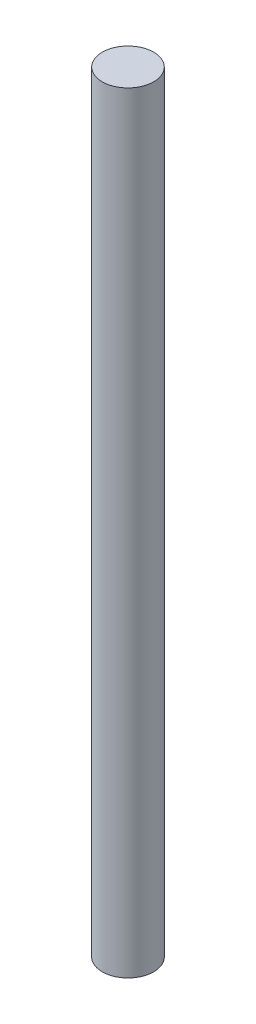
ISO-10303-21;
HEADER;
FILE_DESCRIPTION(('STEP AP214'),'2;1');
FILE_NAME('part.step','',(''),(''),'','','');
FILE_SCHEMA(('AUTOMOTIVE_DESIGN { 1 0 10303 214 1 1 1 1 }'));
ENDSEC;
DATA;
#1=APPLICATION_CONTEXT('core data for automotive mechanical design processes');
#2=APPLICATION_PROTOCOL_DEFINITION('international standard','automotive_design',2000,#1);
#3=PRODUCT_CONTEXT('',#1,'mechanical');
#4=PRODUCT('Part','Part','',(#3));
#5=PRODUCT_RELATED_PRODUCT_CATEGORY('part','',(#4));
#6=PRODUCT_DEFINITION_FORMATION('','',#4);
#7=PRODUCT_DEFINITION_CONTEXT('part definition',#1,'design');
#8=PRODUCT_DEFINITION('design','',#6,#7);
#9=PRODUCT_DEFINITION_SHAPE('','',#8);
#10=(LENGTH_UNIT() NAMED_UNIT(*) SI_UNIT(.MILLI.,.METRE.));
#11=(NAMED_UNIT(*) PLANE_ANGLE_UNIT() SI_UNIT($,.RADIAN.));
#12=(NAMED_UNIT(*) SI_UNIT($,.STERADIAN.) SOLID_ANGLE_UNIT());
#13=UNCERTAINTY_MEASURE_WITH_UNIT(LENGTH_MEASURE(1.E-05),#10,'distance_accuracy_value','');
#14=(GEOMETRIC_REPRESENTATION_CONTEXT(3) GLOBAL_UNCERTAINTY_ASSIGNED_CONTEXT((#13)) GLOBAL_UNIT_ASSIGNED_CONTEXT((#10,
#11,#12)) REPRESENTATION_CONTEXT('',''));
#15=CARTESIAN_POINT('',(0.,0.,0.));
#16=DIRECTION('',(0.,0.,1.));
#17=DIRECTION('',(1.,0.,0.));
#18=AXIS2_PLACEMENT_3D('',#15,#16,#17);
#19=CARTESIAN_POINT('',(0.,150.,0.));
#20=DIRECTION('',(0.,-1.,0.));
#21=DIRECTION('',(0.,0.,-1.));
#22=AXIS2_PLACEMENT_3D('',#19,#20,#21);
#23=CYLINDRICAL_SURFACE('',#22,5.);
#24=CARTESIAN_POINT('',(0.,150.,0.));
#25=DIRECTION('',(0.,1.,0.));
#26=DIRECTION('',(0.,0.,1.));
#27=AXIS2_PLACEMENT_3D('',#24,#25,#26);
#28=CIRCLE('',#27,5.);
#29=CARTESIAN_POINT('',(0.,150.,5.));
#30=VERTEX_POINT('',#29);
#31=EDGE_CURVE('E10',#30,#30,#28,.T.);
#32=ORIENTED_EDGE('',*,*,#31,.F.);
#33=EDGE_LOOP('',(#32));
#34=FACE_BOUND('',#33,.T.);
#35=CARTESIAN_POINT('',(0.,0.,0.));
#36=DIRECTION('',(0.,1.,0.));
#37=DIRECTION('',(0.,0.,1.));
#38=AXIS2_PLACEMENT_3D('',#35,#36,#37);
#39=CIRCLE('',#38,5.);
#40=CARTESIAN_POINT('',(0.,0.,5.));
#41=VERTEX_POINT('',#40);
#42=EDGE_CURVE('E33',#41,#41,#39,.T.);
#43=ORIENTED_EDGE('',*,*,#42,.T.);
#44=EDGE_LOOP('',(#43));
#45=FACE_BOUND('',#44,.T.);
#46=ADVANCED_FACE('F30',(#34,#45),#23,.T.);
#47=CARTESIAN_POINT('',(0.,150.,0.));
#48=DIRECTION('',(0.,1.,0.));
#49=DIRECTION('',(0.,0.,1.));
#50=AXIS2_PLACEMENT_3D('',#47,#48,#49);
#51=PLANE('',#50);
#52=ORIENTED_EDGE('',*,*,#31,.T.);
#53=EDGE_LOOP('',(#52));
#54=FACE_BOUND('',#53,.T.);
#55=ADVANCED_FACE('F45',(#54),#51,.T.);
#56=CARTESIAN_POINT('',(0.,0.,0.));
#57=DIRECTION('',(0.,1.,0.));
#58=DIRECTION('',(0.,0.,1.));
#59=AXIS2_PLACEMENT_3D('',#56,#57,#58);
#60=PLANE('',#59);
#61=ORIENTED_EDGE('',*,*,#42,.F.);
#62=EDGE_LOOP('',(#61));
#63=FACE_BOUND('',#62,.T.);
#64=ADVANCED_FACE('F43',(#63),#60,.F.);
#65=CLOSED_SHELL('',(#46,#55,#64));
#66=MANIFOLD_SOLID_BREP('B2',#65);
#67=ADVANCED_BREP_SHAPE_REPRESENTATION('',(#18,#66),#14);
#68=SHAPE_DEFINITION_REPRESENTATION(#9,#67);
ENDSEC;
END-ISO-10303-21;
